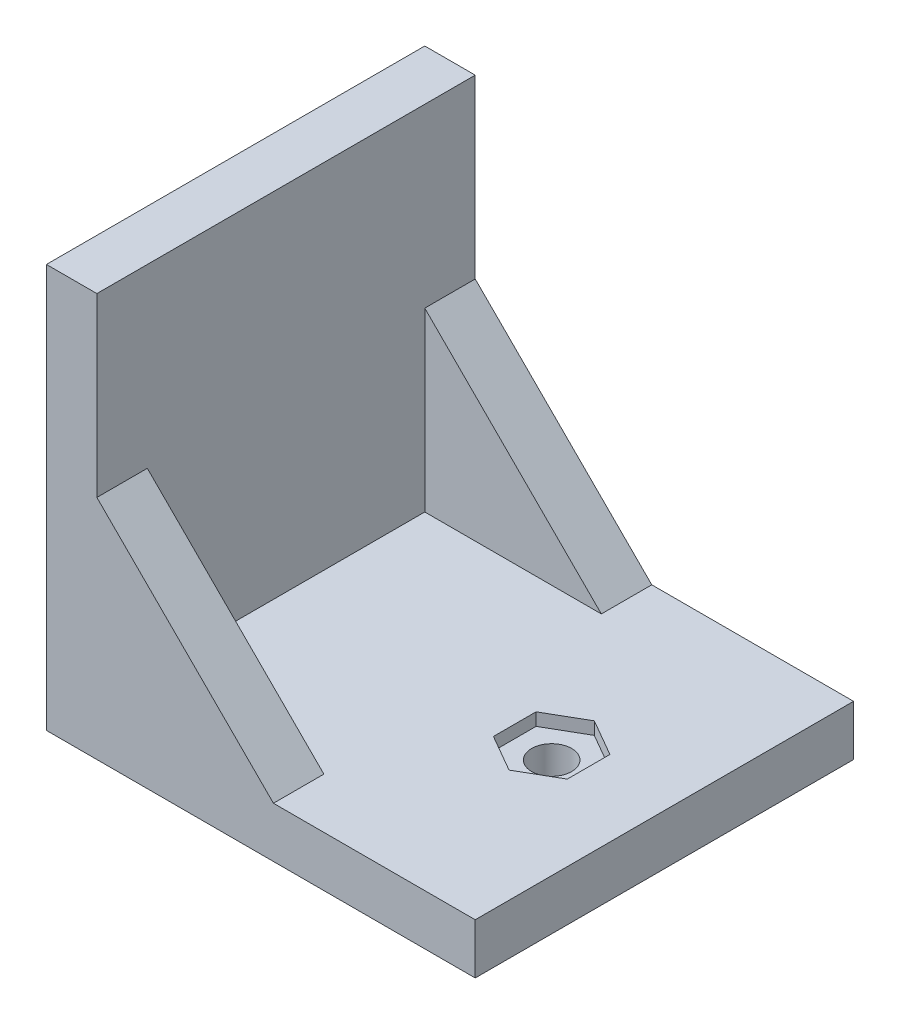
ISO-10303-21;
HEADER;
FILE_DESCRIPTION(('STEP AP214'),'2;1');
FILE_NAME('part.step','',(''),(''),'','','');
FILE_SCHEMA(('AUTOMOTIVE_DESIGN { 1 0 10303 214 1 1 1 1 }'));
ENDSEC;
DATA;
#1=APPLICATION_CONTEXT('core data for automotive mechanical design processes');
#2=APPLICATION_PROTOCOL_DEFINITION('international standard','automotive_design',2000,#1);
#3=PRODUCT_CONTEXT('',#1,'mechanical');
#4=PRODUCT('Part','Part','',(#3));
#5=PRODUCT_RELATED_PRODUCT_CATEGORY('part','',(#4));
#6=PRODUCT_DEFINITION_FORMATION('','',#4);
#7=PRODUCT_DEFINITION_CONTEXT('part definition',#1,'design');
#8=PRODUCT_DEFINITION('design','',#6,#7);
#9=PRODUCT_DEFINITION_SHAPE('','',#8);
#10=(LENGTH_UNIT() NAMED_UNIT(*) SI_UNIT(.MILLI.,.METRE.));
#11=(NAMED_UNIT(*) PLANE_ANGLE_UNIT() SI_UNIT($,.RADIAN.));
#12=(NAMED_UNIT(*) SI_UNIT($,.STERADIAN.) SOLID_ANGLE_UNIT());
#13=UNCERTAINTY_MEASURE_WITH_UNIT(LENGTH_MEASURE(1.E-05),#10,'distance_accuracy_value','');
#14=(GEOMETRIC_REPRESENTATION_CONTEXT(3) GLOBAL_UNCERTAINTY_ASSIGNED_CONTEXT((#13)) GLOBAL_UNIT_ASSIGNED_CONTEXT((#10,
#11,#12)) REPRESENTATION_CONTEXT('',''));
#15=CARTESIAN_POINT('',(0.,0.,0.));
#16=DIRECTION('',(0.,0.,1.));
#17=DIRECTION('',(1.,0.,0.));
#18=AXIS2_PLACEMENT_3D('',#15,#16,#17);
#19=CARTESIAN_POINT('',(0.,8.,0.));
#20=DIRECTION('',(0.,-1.,0.));
#21=DIRECTION('',(0.,0.,-1.));
#22=AXIS2_PLACEMENT_3D('',#19,#20,#21);
#23=PLANE('',#22);
#24=DIRECTION('',(0.866025403784439,0.,0.5));
#25=VECTOR('',#24,1.);
#26=CARTESIAN_POINT('',(44.26875,8.,-26.6188924860583));
#27=LINE('',#26,#25);
#28=CARTESIAN_POINT('',(44.26875,8.,-26.6188924860583));
#29=VERTEX_POINT('',#28);
#30=CARTESIAN_POINT('',(50.125,8.,-23.2377849721165));
#31=VERTEX_POINT('',#30);
#32=EDGE_CURVE('E202',#29,#31,#27,.T.);
#33=ORIENTED_EDGE('',*,*,#32,.F.);
#34=DIRECTION('',(0.,0.,1.));
#35=VECTOR('',#34,1.);
#36=CARTESIAN_POINT('',(44.26875,8.,-33.3811075139417));
#37=LINE('',#36,#35);
#38=CARTESIAN_POINT('',(44.26875,8.,-33.3811075139417));
#39=VERTEX_POINT('',#38);
#40=EDGE_CURVE('E179',#39,#29,#37,.T.);
#41=ORIENTED_EDGE('',*,*,#40,.F.);
#42=DIRECTION('',(-0.866025403784439,0.,0.5));
#43=VECTOR('',#42,1.);
#44=CARTESIAN_POINT('',(50.125,8.,-36.7622150278835));
#45=LINE('',#44,#43);
#46=CARTESIAN_POINT('',(50.125,8.,-36.7622150278835));
#47=VERTEX_POINT('',#46);
#48=EDGE_CURVE('E185',#47,#39,#45,.T.);
#49=ORIENTED_EDGE('',*,*,#48,.F.);
#50=DIRECTION('',(-0.866025403784439,0.,-0.5));
#51=VECTOR('',#50,1.);
#52=CARTESIAN_POINT('',(55.98125,8.,-33.3811075139417));
#53=LINE('',#52,#51);
#54=CARTESIAN_POINT('',(55.98125,8.,-33.3811075139417));
#55=VERTEX_POINT('',#54);
#56=EDGE_CURVE('E211',#55,#47,#53,.T.);
#57=ORIENTED_EDGE('',*,*,#56,.F.);
#58=DIRECTION('',(0.,0.,-1.));
#59=VECTOR('',#58,1.);
#60=CARTESIAN_POINT('',(55.98125,8.,-26.6188924860583));
#61=LINE('',#60,#59);
#62=CARTESIAN_POINT('',(55.98125,8.,-26.6188924860583));
#63=VERTEX_POINT('',#62);
#64=EDGE_CURVE('E208',#63,#55,#61,.T.);
#65=ORIENTED_EDGE('',*,*,#64,.F.);
#66=DIRECTION('',(0.866025403784439,0.,-0.5));
#67=VECTOR('',#66,1.);
#68=CARTESIAN_POINT('',(50.125,8.,-23.2377849721165));
#69=LINE('',#68,#67);
#70=EDGE_CURVE('E205',#31,#63,#69,.T.);
#71=ORIENTED_EDGE('',*,*,#70,.F.);
#72=EDGE_LOOP('',(#33,#41,#49,#57,#65,#71));
#73=FACE_BOUND('',#72,.T.);
#74=DIRECTION('',(0.,0.,1.));
#75=VECTOR('',#74,1.);
#76=CARTESIAN_POINT('',(36.,8.,-8.));
#77=LINE('',#76,#75);
#78=CARTESIAN_POINT('',(36.,8.,-8.));
#79=VERTEX_POINT('',#78);
#80=CARTESIAN_POINT('',(36.,8.,0.));
#81=VERTEX_POINT('',#80);
#82=EDGE_CURVE('E57',#79,#81,#77,.T.);
#83=ORIENTED_EDGE('',*,*,#82,.T.);
#84=DIRECTION('',(1.,0.,0.));
#85=VECTOR('',#84,1.);
#86=CARTESIAN_POINT('',(0.,8.,0.));
#87=LINE('',#86,#85);
#88=CARTESIAN_POINT('',(68.,8.,0.));
#89=VERTEX_POINT('',#88);
#90=EDGE_CURVE('E248',#81,#89,#87,.T.);
#91=ORIENTED_EDGE('',*,*,#90,.T.);
#92=DIRECTION('',(0.,0.,-1.));
#93=VECTOR('',#92,1.);
#94=CARTESIAN_POINT('',(68.,8.,0.));
#95=LINE('',#94,#93);
#96=CARTESIAN_POINT('',(68.,8.,-60.));
#97=VERTEX_POINT('',#96);
#98=EDGE_CURVE('E250',#89,#97,#95,.T.);
#99=ORIENTED_EDGE('',*,*,#98,.T.);
#100=DIRECTION('',(-1.,0.,0.));
#101=VECTOR('',#100,1.);
#102=CARTESIAN_POINT('',(0.,8.,-60.));
#103=LINE('',#102,#101);
#104=CARTESIAN_POINT('',(36.,8.,-60.));
#105=VERTEX_POINT('',#104);
#106=EDGE_CURVE('E253',#97,#105,#103,.T.);
#107=ORIENTED_EDGE('',*,*,#106,.T.);
#108=DIRECTION('',(0.,0.,-1.));
#109=VECTOR('',#108,1.);
#110=CARTESIAN_POINT('',(36.,8.,-52.));
#111=LINE('',#110,#109);
#112=CARTESIAN_POINT('',(36.,8.,-52.));
#113=VERTEX_POINT('',#112);
#114=EDGE_CURVE('E160',#113,#105,#111,.T.);
#115=ORIENTED_EDGE('',*,*,#114,.F.);
#116=DIRECTION('',(-1.,0.,0.));
#117=VECTOR('',#116,1.);
#118=CARTESIAN_POINT('',(36.,8.,-52.));
#119=LINE('',#118,#117);
#120=CARTESIAN_POINT('',(8.,8.,-52.));
#121=VERTEX_POINT('',#120);
#122=EDGE_CURVE('E161',#113,#121,#119,.T.);
#123=ORIENTED_EDGE('',*,*,#122,.T.);
#124=DIRECTION('',(0.,0.,-1.));
#125=VECTOR('',#124,1.);
#126=CARTESIAN_POINT('',(8.,8.,0.));
#127=LINE('',#126,#125);
#128=CARTESIAN_POINT('',(8.,8.,-8.));
#129=VERTEX_POINT('',#128);
#130=EDGE_CURVE('E171',#129,#121,#127,.T.);
#131=ORIENTED_EDGE('',*,*,#130,.F.);
#132=DIRECTION('',(-1.,0.,0.));
#133=VECTOR('',#132,1.);
#134=CARTESIAN_POINT('',(36.,8.,-8.));
#135=LINE('',#134,#133);
#136=EDGE_CURVE('E52',#79,#129,#135,.T.);
#137=ORIENTED_EDGE('',*,*,#136,.F.);
#138=EDGE_LOOP('',(#83,#91,#99,#107,#115,#123,#131,#137));
#139=FACE_BOUND('',#138,.T.);
#140=ADVANCED_FACE('F36',(#73,#139),#23,.F.);
#141=CARTESIAN_POINT('',(8.,64.,0.));
#142=DIRECTION('',(-1.,0.,0.));
#143=DIRECTION('',(0.,0.,1.));
#144=AXIS2_PLACEMENT_3D('',#141,#142,#143);
#145=PLANE('',#144);
#146=DIRECTION('',(0.,0.,1.));
#147=VECTOR('',#146,1.);
#148=CARTESIAN_POINT('',(8.,36.0000000000001,-8.));
#149=LINE('',#148,#147);
#150=CARTESIAN_POINT('',(8.,36.0000000000001,-8.));
#151=VERTEX_POINT('',#150);
#152=CARTESIAN_POINT('',(8.,36.0000000000001,0.));
#153=VERTEX_POINT('',#152);
#154=EDGE_CURVE('E173',#151,#153,#149,.T.);
#155=ORIENTED_EDGE('',*,*,#154,.F.);
#156=DIRECTION('',(0.,1.,0.));
#157=VECTOR('',#156,1.);
#158=CARTESIAN_POINT('',(8.,36.0000000000001,-8.));
#159=LINE('',#158,#157);
#160=EDGE_CURVE('E299',#129,#151,#159,.T.);
#161=ORIENTED_EDGE('',*,*,#160,.F.);
#162=ORIENTED_EDGE('',*,*,#130,.T.);
#163=DIRECTION('',(0.,1.,0.));
#164=VECTOR('',#163,1.);
#165=CARTESIAN_POINT('',(8.,36.0000000000001,-52.));
#166=LINE('',#165,#164);
#167=CARTESIAN_POINT('',(8.,36.0000000000001,-52.));
#168=VERTEX_POINT('',#167);
#169=EDGE_CURVE('E166',#121,#168,#166,.T.);
#170=ORIENTED_EDGE('',*,*,#169,.T.);
#171=DIRECTION('',(0.,0.,-1.));
#172=VECTOR('',#171,1.);
#173=CARTESIAN_POINT('',(8.,36.0000000000001,-52.));
#174=LINE('',#173,#172);
#175=CARTESIAN_POINT('',(8.,36.0000000000001,-60.));
#176=VERTEX_POINT('',#175);
#177=EDGE_CURVE('E149',#168,#176,#174,.T.);
#178=ORIENTED_EDGE('',*,*,#177,.T.);
#179=DIRECTION('',(0.,-1.,0.));
#180=VECTOR('',#179,1.);
#181=CARTESIAN_POINT('',(8.,64.,-60.));
#182=LINE('',#181,#180);
#183=CARTESIAN_POINT('',(8.,64.,-60.));
#184=VERTEX_POINT('',#183);
#185=EDGE_CURVE('E242',#184,#176,#182,.T.);
#186=ORIENTED_EDGE('',*,*,#185,.F.);
#187=DIRECTION('',(0.,0.,-1.));
#188=VECTOR('',#187,1.);
#189=CARTESIAN_POINT('',(8.,64.,0.));
#190=LINE('',#189,#188);
#191=CARTESIAN_POINT('',(8.,64.,0.));
#192=VERTEX_POINT('',#191);
#193=EDGE_CURVE('E234',#192,#184,#190,.T.);
#194=ORIENTED_EDGE('',*,*,#193,.F.);
#195=DIRECTION('',(0.,-1.,0.));
#196=VECTOR('',#195,1.);
#197=CARTESIAN_POINT('',(8.,64.,0.));
#198=LINE('',#197,#196);
#199=EDGE_CURVE('E245',#192,#153,#198,.T.);
#200=ORIENTED_EDGE('',*,*,#199,.T.);
#201=EDGE_LOOP('',(#155,#161,#162,#170,#178,#186,#194,#200));
#202=FACE_BOUND('',#201,.T.);
#203=ADVANCED_FACE('F170',(#202),#145,.F.);
#204=CARTESIAN_POINT('',(50.125,0.,-30.));
#205=DIRECTION('',(0.,1.,0.));
#206=DIRECTION('',(0.,0.,1.));
#207=AXIS2_PLACEMENT_3D('',#204,#205,#206);
#208=CYLINDRICAL_SURFACE('',#207,3.175);
#209=CARTESIAN_POINT('',(50.125,0.,-30.));
#210=DIRECTION('',(0.,1.,0.));
#211=DIRECTION('',(0.,0.,1.));
#212=AXIS2_PLACEMENT_3D('',#209,#210,#211);
#213=CIRCLE('',#212,3.175);
#214=CARTESIAN_POINT('',(50.125,0.,-26.825));
#215=VERTEX_POINT('',#214);
#216=EDGE_CURVE('E228',#215,#215,#213,.T.);
#217=ORIENTED_EDGE('',*,*,#216,.F.);
#218=EDGE_LOOP('',(#217));
#219=FACE_BOUND('',#218,.T.);
#220=CARTESIAN_POINT('',(50.125,6.,-30.));
#221=DIRECTION('',(0.,1.,0.));
#222=DIRECTION('',(0.,0.,1.));
#223=AXIS2_PLACEMENT_3D('',#220,#221,#222);
#224=CIRCLE('',#223,3.175);
#225=CARTESIAN_POINT('',(50.125,6.,-26.825));
#226=VERTEX_POINT('',#225);
#227=EDGE_CURVE('E40',#226,#226,#224,.F.);
#228=ORIENTED_EDGE('',*,*,#227,.F.);
#229=EDGE_LOOP('',(#228));
#230=FACE_BOUND('',#229,.T.);
#231=ADVANCED_FACE('F320',(#219,#230),#208,.F.);
#232=CARTESIAN_POINT('',(0.,8.,0.));
#233=DIRECTION('',(1.,0.,0.));
#234=DIRECTION('',(0.,0.,-1.));
#235=AXIS2_PLACEMENT_3D('',#232,#233,#234);
#236=PLANE('',#235);
#237=DIRECTION('',(0.,0.,1.));
#238=VECTOR('',#237,1.);
#239=CARTESIAN_POINT('',(0.,0.,0.));
#240=LINE('',#239,#238);
#241=CARTESIAN_POINT('',(0.,0.,-60.));
#242=VERTEX_POINT('',#241);
#243=CARTESIAN_POINT('',(0.,0.,0.));
#244=VERTEX_POINT('',#243);
#245=EDGE_CURVE('E247',#242,#244,#240,.T.);
#246=ORIENTED_EDGE('',*,*,#245,.T.);
#247=DIRECTION('',(0.,-1.,0.));
#248=VECTOR('',#247,1.);
#249=CARTESIAN_POINT('',(0.,8.,0.));
#250=LINE('',#249,#248);
#251=CARTESIAN_POINT('',(0.,64.,0.));
#252=VERTEX_POINT('',#251);
#253=EDGE_CURVE('E11',#252,#244,#250,.T.);
#254=ORIENTED_EDGE('',*,*,#253,.F.);
#255=DIRECTION('',(0.,0.,1.));
#256=VECTOR('',#255,1.);
#257=CARTESIAN_POINT('',(0.,64.,-60.));
#258=LINE('',#257,#256);
#259=CARTESIAN_POINT('',(0.,64.,-60.));
#260=VERTEX_POINT('',#259);
#261=EDGE_CURVE('E239',#260,#252,#258,.T.);
#262=ORIENTED_EDGE('',*,*,#261,.F.);
#263=DIRECTION('',(0.,-1.,0.));
#264=VECTOR('',#263,1.);
#265=CARTESIAN_POINT('',(0.,8.,-60.));
#266=LINE('',#265,#264);
#267=EDGE_CURVE('E256',#260,#242,#266,.T.);
#268=ORIENTED_EDGE('',*,*,#267,.T.);
#269=EDGE_LOOP('',(#246,#254,#262,#268));
#270=FACE_BOUND('',#269,.T.);
#271=ADVANCED_FACE('F38',(#270),#236,.F.);
#272=CARTESIAN_POINT('',(0.,8.,0.));
#273=DIRECTION('',(0.,0.,-1.));
#274=DIRECTION('',(-1.,0.,0.));
#275=AXIS2_PLACEMENT_3D('',#272,#273,#274);
#276=PLANE('',#275);
#277=ORIENTED_EDGE('',*,*,#90,.F.);
#278=DIRECTION('',(0.707106781186546,-0.707106781186549,0.));
#279=VECTOR('',#278,1.);
#280=CARTESIAN_POINT('',(36.,8.,0.));
#281=LINE('',#280,#279);
#282=EDGE_CURVE('E294',#153,#81,#281,.T.);
#283=ORIENTED_EDGE('',*,*,#282,.F.);
#284=ORIENTED_EDGE('',*,*,#199,.F.);
#285=DIRECTION('',(1.,0.,0.));
#286=VECTOR('',#285,1.);
#287=CARTESIAN_POINT('',(0.,64.,0.));
#288=LINE('',#287,#286);
#289=EDGE_CURVE('E231',#252,#192,#288,.T.);
#290=ORIENTED_EDGE('',*,*,#289,.F.);
#291=ORIENTED_EDGE('',*,*,#253,.T.);
#292=DIRECTION('',(1.,0.,0.));
#293=VECTOR('',#292,1.);
#294=CARTESIAN_POINT('',(0.,0.,0.));
#295=LINE('',#294,#293);
#296=CARTESIAN_POINT('',(68.,0.,0.));
#297=VERTEX_POINT('',#296);
#298=EDGE_CURVE('E259',#244,#297,#295,.T.);
#299=ORIENTED_EDGE('',*,*,#298,.T.);
#300=DIRECTION('',(0.,-1.,0.));
#301=VECTOR('',#300,1.);
#302=CARTESIAN_POINT('',(68.,8.,0.));
#303=LINE('',#302,#301);
#304=EDGE_CURVE('E45',#89,#297,#303,.T.);
#305=ORIENTED_EDGE('',*,*,#304,.F.);
#306=EDGE_LOOP('',(#277,#283,#284,#290,#291,#299,#305));
#307=FACE_BOUND('',#306,.T.);
#308=ADVANCED_FACE('F291',(#307),#276,.F.);
#309=CARTESIAN_POINT('',(68.,8.,0.));
#310=DIRECTION('',(-1.,0.,0.));
#311=DIRECTION('',(0.,0.,1.));
#312=AXIS2_PLACEMENT_3D('',#309,#310,#311);
#313=PLANE('',#312);
#314=DIRECTION('',(0.,0.,-1.));
#315=VECTOR('',#314,1.);
#316=CARTESIAN_POINT('',(68.,0.,0.));
#317=LINE('',#316,#315);
#318=CARTESIAN_POINT('',(68.,0.,-60.));
#319=VERTEX_POINT('',#318);
#320=EDGE_CURVE('E261',#297,#319,#317,.T.);
#321=ORIENTED_EDGE('',*,*,#320,.T.);
#322=DIRECTION('',(0.,-1.,0.));
#323=VECTOR('',#322,1.);
#324=CARTESIAN_POINT('',(68.,8.,-60.));
#325=LINE('',#324,#323);
#326=EDGE_CURVE('E266',#97,#319,#325,.T.);
#327=ORIENTED_EDGE('',*,*,#326,.F.);
#328=ORIENTED_EDGE('',*,*,#98,.F.);
#329=ORIENTED_EDGE('',*,*,#304,.T.);
#330=EDGE_LOOP('',(#321,#327,#328,#329));
#331=FACE_BOUND('',#330,.T.);
#332=ADVANCED_FACE('F274',(#331),#313,.F.);
#333=CARTESIAN_POINT('',(0.,8.,-60.));
#334=DIRECTION('',(0.,0.,1.));
#335=DIRECTION('',(1.,0.,0.));
#336=AXIS2_PLACEMENT_3D('',#333,#334,#335);
#337=PLANE('',#336);
#338=DIRECTION('',(-1.,0.,0.));
#339=VECTOR('',#338,1.);
#340=CARTESIAN_POINT('',(0.,0.,-60.));
#341=LINE('',#340,#339);
#342=EDGE_CURVE('E251',#319,#242,#341,.T.);
#343=ORIENTED_EDGE('',*,*,#342,.T.);
#344=ORIENTED_EDGE('',*,*,#267,.F.);
#345=DIRECTION('',(-1.,0.,0.));
#346=VECTOR('',#345,1.);
#347=CARTESIAN_POINT('',(8.,64.,-60.));
#348=LINE('',#347,#346);
#349=EDGE_CURVE('E236',#184,#260,#348,.T.);
#350=ORIENTED_EDGE('',*,*,#349,.F.);
#351=ORIENTED_EDGE('',*,*,#185,.T.);
#352=DIRECTION('',(0.707106781186546,-0.707106781186549,0.));
#353=VECTOR('',#352,1.);
#354=CARTESIAN_POINT('',(36.,8.,-60.));
#355=LINE('',#354,#353);
#356=EDGE_CURVE('E155',#176,#105,#355,.T.);
#357=ORIENTED_EDGE('',*,*,#356,.T.);
#358=ORIENTED_EDGE('',*,*,#106,.F.);
#359=ORIENTED_EDGE('',*,*,#326,.T.);
#360=EDGE_LOOP('',(#343,#344,#350,#351,#357,#358,#359));
#361=FACE_BOUND('',#360,.T.);
#362=ADVANCED_FACE('F282',(#361),#337,.F.);
#363=CARTESIAN_POINT('',(0.,0.,0.));
#364=DIRECTION('',(0.,-1.,0.));
#365=DIRECTION('',(0.,0.,-1.));
#366=AXIS2_PLACEMENT_3D('',#363,#364,#365);
#367=PLANE('',#366);
#368=ORIENTED_EDGE('',*,*,#216,.T.);
#369=EDGE_LOOP('',(#368));
#370=FACE_BOUND('',#369,.T.);
#371=ORIENTED_EDGE('',*,*,#245,.F.);
#372=ORIENTED_EDGE('',*,*,#342,.F.);
#373=ORIENTED_EDGE('',*,*,#320,.F.);
#374=ORIENTED_EDGE('',*,*,#298,.F.);
#375=EDGE_LOOP('',(#371,#372,#373,#374));
#376=FACE_BOUND('',#375,.T.);
#377=ADVANCED_FACE('F280',(#370,#376),#367,.T.);
#378=CARTESIAN_POINT('',(0.,64.,0.));
#379=DIRECTION('',(0.,1.,0.));
#380=DIRECTION('',(0.,0.,1.));
#381=AXIS2_PLACEMENT_3D('',#378,#379,#380);
#382=PLANE('',#381);
#383=ORIENTED_EDGE('',*,*,#289,.T.);
#384=ORIENTED_EDGE('',*,*,#193,.T.);
#385=ORIENTED_EDGE('',*,*,#349,.T.);
#386=ORIENTED_EDGE('',*,*,#261,.T.);
#387=EDGE_LOOP('',(#383,#384,#385,#386));
#388=FACE_BOUND('',#387,.T.);
#389=ADVANCED_FACE('F289',(#388),#382,.T.);
#390=CARTESIAN_POINT('',(0.,6.,0.));
#391=DIRECTION('',(0.,1.,0.));
#392=DIRECTION('',(0.,0.,1.));
#393=AXIS2_PLACEMENT_3D('',#390,#391,#392);
#394=PLANE('',#393);
#395=DIRECTION('',(0.,0.,1.));
#396=VECTOR('',#395,1.);
#397=CARTESIAN_POINT('',(44.26875,6.,-33.3811075139417));
#398=LINE('',#397,#396);
#399=CARTESIAN_POINT('',(44.26875,6.,-33.3811075139417));
#400=VERTEX_POINT('',#399);
#401=CARTESIAN_POINT('',(44.26875,6.,-26.6188924860583));
#402=VERTEX_POINT('',#401);
#403=EDGE_CURVE('E181',#400,#402,#398,.T.);
#404=ORIENTED_EDGE('',*,*,#403,.T.);
#405=DIRECTION('',(0.866025403784439,0.,0.5));
#406=VECTOR('',#405,1.);
#407=CARTESIAN_POINT('',(44.26875,6.,-26.6188924860583));
#408=LINE('',#407,#406);
#409=CARTESIAN_POINT('',(50.125,6.,-23.2377849721165));
#410=VERTEX_POINT('',#409);
#411=EDGE_CURVE('E184',#402,#410,#408,.T.);
#412=ORIENTED_EDGE('',*,*,#411,.T.);
#413=DIRECTION('',(0.866025403784439,0.,-0.5));
#414=VECTOR('',#413,1.);
#415=CARTESIAN_POINT('',(50.125,6.,-23.2377849721165));
#416=LINE('',#415,#414);
#417=CARTESIAN_POINT('',(55.98125,6.,-26.6188924860583));
#418=VERTEX_POINT('',#417);
#419=EDGE_CURVE('E188',#410,#418,#416,.T.);
#420=ORIENTED_EDGE('',*,*,#419,.T.);
#421=DIRECTION('',(0.,0.,-1.));
#422=VECTOR('',#421,1.);
#423=CARTESIAN_POINT('',(55.98125,6.,-26.6188924860583));
#424=LINE('',#423,#422);
#425=CARTESIAN_POINT('',(55.98125,6.,-33.3811075139417));
#426=VERTEX_POINT('',#425);
#427=EDGE_CURVE('E191',#418,#426,#424,.T.);
#428=ORIENTED_EDGE('',*,*,#427,.T.);
#429=DIRECTION('',(-0.866025403784439,0.,-0.5));
#430=VECTOR('',#429,1.);
#431=CARTESIAN_POINT('',(55.98125,6.,-33.3811075139417));
#432=LINE('',#431,#430);
#433=CARTESIAN_POINT('',(50.125,6.,-36.7622150278835));
#434=VERTEX_POINT('',#433);
#435=EDGE_CURVE('E194',#426,#434,#432,.T.);
#436=ORIENTED_EDGE('',*,*,#435,.T.);
#437=DIRECTION('',(-0.866025403784439,0.,0.5));
#438=VECTOR('',#437,1.);
#439=CARTESIAN_POINT('',(50.125,6.,-36.7622150278835));
#440=LINE('',#439,#438);
#441=EDGE_CURVE('E197',#434,#400,#440,.T.);
#442=ORIENTED_EDGE('',*,*,#441,.T.);
#443=EDGE_LOOP('',(#404,#412,#420,#428,#436,#442));
#444=FACE_BOUND('',#443,.T.);
#445=ORIENTED_EDGE('',*,*,#227,.T.);
#446=EDGE_LOOP('',(#445));
#447=FACE_BOUND('',#446,.T.);
#448=ADVANCED_FACE('F348',(#444,#447),#394,.T.);
#449=CARTESIAN_POINT('',(44.26875,6.,-33.3811075139417));
#450=DIRECTION('',(-1.,0.,0.));
#451=DIRECTION('',(0.,0.,1.));
#452=AXIS2_PLACEMENT_3D('',#449,#450,#451);
#453=PLANE('',#452);
#454=ORIENTED_EDGE('',*,*,#40,.T.);
#455=DIRECTION('',(0.,1.,0.));
#456=VECTOR('',#455,1.);
#457=CARTESIAN_POINT('',(44.26875,6.,-26.6188924860583));
#458=LINE('',#457,#456);
#459=EDGE_CURVE('E200',#402,#29,#458,.T.);
#460=ORIENTED_EDGE('',*,*,#459,.F.);
#461=ORIENTED_EDGE('',*,*,#403,.F.);
#462=DIRECTION('',(0.,1.,0.));
#463=VECTOR('',#462,1.);
#464=CARTESIAN_POINT('',(44.26875,6.,-33.3811075139417));
#465=LINE('',#464,#463);
#466=EDGE_CURVE('E216',#400,#39,#465,.T.);
#467=ORIENTED_EDGE('',*,*,#466,.T.);
#468=EDGE_LOOP('',(#454,#460,#461,#467));
#469=FACE_BOUND('',#468,.T.);
#470=ADVANCED_FACE('F345',(#469),#453,.F.);
#471=CARTESIAN_POINT('',(50.125,6.,-36.7622150278835));
#472=DIRECTION('',(-0.5,0.,-0.866025403784439));
#473=DIRECTION('',(-0.866025403784439,0.,0.5));
#474=AXIS2_PLACEMENT_3D('',#471,#472,#473);
#475=PLANE('',#474);
#476=ORIENTED_EDGE('',*,*,#48,.T.);
#477=ORIENTED_EDGE('',*,*,#466,.F.);
#478=ORIENTED_EDGE('',*,*,#441,.F.);
#479=DIRECTION('',(0.,1.,0.));
#480=VECTOR('',#479,1.);
#481=CARTESIAN_POINT('',(50.125,6.,-36.7622150278835));
#482=LINE('',#481,#480);
#483=EDGE_CURVE('E218',#434,#47,#482,.T.);
#484=ORIENTED_EDGE('',*,*,#483,.T.);
#485=EDGE_LOOP('',(#476,#477,#478,#484));
#486=FACE_BOUND('',#485,.T.);
#487=ADVANCED_FACE('F357',(#486),#475,.F.);
#488=CARTESIAN_POINT('',(55.98125,6.,-33.3811075139417));
#489=DIRECTION('',(0.5,0.,-0.866025403784439));
#490=DIRECTION('',(-0.866025403784439,0.,-0.5));
#491=AXIS2_PLACEMENT_3D('',#488,#489,#490);
#492=PLANE('',#491);
#493=ORIENTED_EDGE('',*,*,#56,.T.);
#494=ORIENTED_EDGE('',*,*,#483,.F.);
#495=ORIENTED_EDGE('',*,*,#435,.F.);
#496=DIRECTION('',(0.,1.,0.));
#497=VECTOR('',#496,1.);
#498=CARTESIAN_POINT('',(55.98125,6.,-33.3811075139417));
#499=LINE('',#498,#497);
#500=EDGE_CURVE('E220',#426,#55,#499,.T.);
#501=ORIENTED_EDGE('',*,*,#500,.T.);
#502=EDGE_LOOP('',(#493,#494,#495,#501));
#503=FACE_BOUND('',#502,.T.);
#504=ADVANCED_FACE('F365',(#503),#492,.F.);
#505=CARTESIAN_POINT('',(55.98125,6.,-26.6188924860583));
#506=DIRECTION('',(1.,0.,0.));
#507=DIRECTION('',(0.,0.,-1.));
#508=AXIS2_PLACEMENT_3D('',#505,#506,#507);
#509=PLANE('',#508);
#510=ORIENTED_EDGE('',*,*,#64,.T.);
#511=ORIENTED_EDGE('',*,*,#500,.F.);
#512=ORIENTED_EDGE('',*,*,#427,.F.);
#513=DIRECTION('',(0.,1.,0.));
#514=VECTOR('',#513,1.);
#515=CARTESIAN_POINT('',(55.98125,6.,-26.6188924860583));
#516=LINE('',#515,#514);
#517=EDGE_CURVE('E222',#418,#63,#516,.T.);
#518=ORIENTED_EDGE('',*,*,#517,.T.);
#519=EDGE_LOOP('',(#510,#511,#512,#518));
#520=FACE_BOUND('',#519,.T.);
#521=ADVANCED_FACE('F369',(#520),#509,.F.);
#522=CARTESIAN_POINT('',(50.125,6.,-23.2377849721165));
#523=DIRECTION('',(0.5,0.,0.866025403784439));
#524=DIRECTION('',(0.866025403784439,0.,-0.5));
#525=AXIS2_PLACEMENT_3D('',#522,#523,#524);
#526=PLANE('',#525);
#527=ORIENTED_EDGE('',*,*,#70,.T.);
#528=ORIENTED_EDGE('',*,*,#517,.F.);
#529=ORIENTED_EDGE('',*,*,#419,.F.);
#530=DIRECTION('',(0.,1.,0.));
#531=VECTOR('',#530,1.);
#532=CARTESIAN_POINT('',(50.125,6.,-23.2377849721165));
#533=LINE('',#532,#531);
#534=EDGE_CURVE('E224',#410,#31,#533,.T.);
#535=ORIENTED_EDGE('',*,*,#534,.T.);
#536=EDGE_LOOP('',(#527,#528,#529,#535));
#537=FACE_BOUND('',#536,.T.);
#538=ADVANCED_FACE('F373',(#537),#526,.F.);
#539=CARTESIAN_POINT('',(44.26875,6.,-26.6188924860583));
#540=DIRECTION('',(-0.5,0.,0.866025403784439));
#541=DIRECTION('',(0.866025403784439,0.,0.5));
#542=AXIS2_PLACEMENT_3D('',#539,#540,#541);
#543=PLANE('',#542);
#544=ORIENTED_EDGE('',*,*,#32,.T.);
#545=ORIENTED_EDGE('',*,*,#534,.F.);
#546=ORIENTED_EDGE('',*,*,#411,.F.);
#547=ORIENTED_EDGE('',*,*,#459,.T.);
#548=EDGE_LOOP('',(#544,#545,#546,#547));
#549=FACE_BOUND('',#548,.T.);
#550=ADVANCED_FACE('F376',(#549),#543,.F.);
#551=CARTESIAN_POINT('',(36.,8.,-52.));
#552=DIRECTION('',(0.707106781186549,0.707106781186546,0.));
#553=DIRECTION('',(-0.707106781186546,0.707106781186549,0.));
#554=AXIS2_PLACEMENT_3D('',#551,#552,#553);
#555=PLANE('',#554);
#556=ORIENTED_EDGE('',*,*,#356,.F.);
#557=ORIENTED_EDGE('',*,*,#177,.F.);
#558=DIRECTION('',(0.707106781186546,-0.707106781186549,0.));
#559=VECTOR('',#558,1.);
#560=CARTESIAN_POINT('',(36.,8.,-52.));
#561=LINE('',#560,#559);
#562=EDGE_CURVE('E152',#168,#113,#561,.T.);
#563=ORIENTED_EDGE('',*,*,#562,.T.);
#564=ORIENTED_EDGE('',*,*,#114,.T.);
#565=EDGE_LOOP('',(#556,#557,#563,#564));
#566=FACE_BOUND('',#565,.T.);
#567=ADVANCED_FACE('F151',(#566),#555,.T.);
#568=CARTESIAN_POINT('',(0.,0.,-52.));
#569=DIRECTION('',(0.,0.,-1.));
#570=DIRECTION('',(-1.,0.,0.));
#571=AXIS2_PLACEMENT_3D('',#568,#569,#570);
#572=PLANE('',#571);
#573=ORIENTED_EDGE('',*,*,#169,.F.);
#574=ORIENTED_EDGE('',*,*,#122,.F.);
#575=ORIENTED_EDGE('',*,*,#562,.F.);
#576=EDGE_LOOP('',(#573,#574,#575));
#577=FACE_BOUND('',#576,.T.);
#578=ADVANCED_FACE('F165',(#577),#572,.F.);
#579=CARTESIAN_POINT('',(36.,8.,-8.));
#580=DIRECTION('',(-0.707106781186549,-0.707106781186546,0.));
#581=DIRECTION('',(0.707106781186546,-0.707106781186549,0.));
#582=AXIS2_PLACEMENT_3D('',#579,#580,#581);
#583=PLANE('',#582);
#584=ORIENTED_EDGE('',*,*,#282,.T.);
#585=ORIENTED_EDGE('',*,*,#82,.F.);
#586=DIRECTION('',(0.707106781186546,-0.707106781186549,0.));
#587=VECTOR('',#586,1.);
#588=CARTESIAN_POINT('',(36.,8.,-8.));
#589=LINE('',#588,#587);
#590=EDGE_CURVE('E304',#151,#79,#589,.T.);
#591=ORIENTED_EDGE('',*,*,#590,.F.);
#592=ORIENTED_EDGE('',*,*,#154,.T.);
#593=EDGE_LOOP('',(#584,#585,#591,#592));
#594=FACE_BOUND('',#593,.T.);
#595=ADVANCED_FACE('F298',(#594),#583,.F.);
#596=CARTESIAN_POINT('',(0.,0.,-8.));
#597=DIRECTION('',(0.,0.,1.));
#598=DIRECTION('',(-1.,0.,0.));
#599=AXIS2_PLACEMENT_3D('',#596,#597,#598);
#600=PLANE('',#599);
#601=ORIENTED_EDGE('',*,*,#160,.T.);
#602=ORIENTED_EDGE('',*,*,#590,.T.);
#603=ORIENTED_EDGE('',*,*,#136,.T.);
#604=EDGE_LOOP('',(#601,#602,#603));
#605=FACE_BOUND('',#604,.T.);
#606=ADVANCED_FACE('F307',(#605),#600,.F.);
#607=CLOSED_SHELL('',(#140,#203,#231,#271,#308,#332,#362,#377,#389,#448,#470,#487,#504,#521,
#538,#550,#567,#578,#595,#606));
#608=MANIFOLD_SOLID_BREP('B2',#607);
#609=ADVANCED_BREP_SHAPE_REPRESENTATION('',(#18,#608),#14);
#610=SHAPE_DEFINITION_REPRESENTATION(#9,#609);
ENDSEC;
END-ISO-10303-21;
